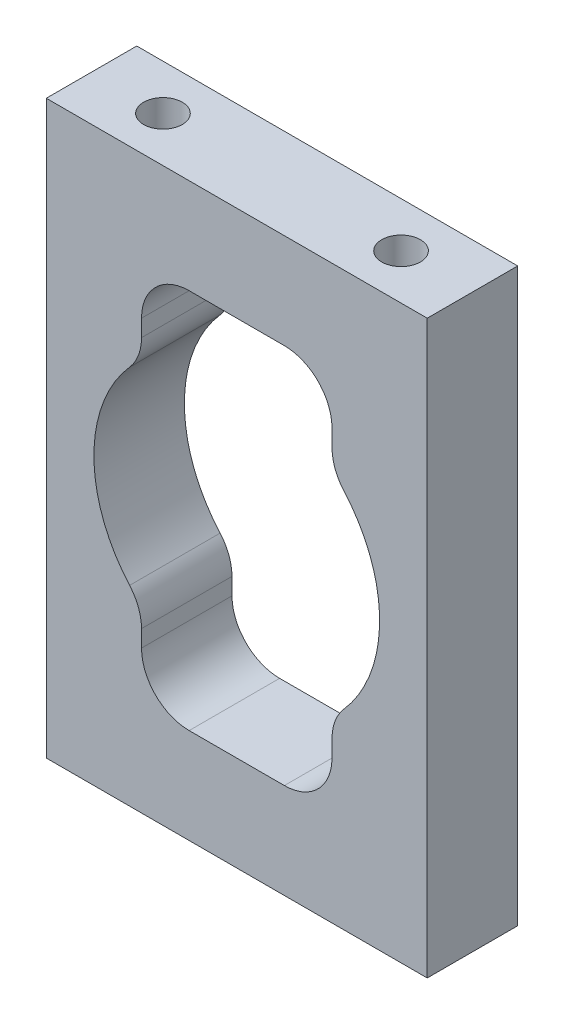
ISO-10303-21;
HEADER;
FILE_DESCRIPTION(('STEP AP214'),'2;1');
FILE_NAME('part.step','',(''),(''),'','','');
FILE_SCHEMA(('AUTOMOTIVE_DESIGN { 1 0 10303 214 1 1 1 1 }'));
ENDSEC;
DATA;
#1=APPLICATION_CONTEXT('core data for automotive mechanical design processes');
#2=APPLICATION_PROTOCOL_DEFINITION('international standard','automotive_design',2000,#1);
#3=PRODUCT_CONTEXT('',#1,'mechanical');
#4=PRODUCT('Part','Part','',(#3));
#5=PRODUCT_RELATED_PRODUCT_CATEGORY('part','',(#4));
#6=PRODUCT_DEFINITION_FORMATION('','',#4);
#7=PRODUCT_DEFINITION_CONTEXT('part definition',#1,'design');
#8=PRODUCT_DEFINITION('design','',#6,#7);
#9=PRODUCT_DEFINITION_SHAPE('','',#8);
#10=(LENGTH_UNIT() NAMED_UNIT(*) SI_UNIT(.MILLI.,.METRE.));
#11=(NAMED_UNIT(*) PLANE_ANGLE_UNIT() SI_UNIT($,.RADIAN.));
#12=(NAMED_UNIT(*) SI_UNIT($,.STERADIAN.) SOLID_ANGLE_UNIT());
#13=UNCERTAINTY_MEASURE_WITH_UNIT(LENGTH_MEASURE(1.E-05),#10,'distance_accuracy_value','');
#14=(GEOMETRIC_REPRESENTATION_CONTEXT(3) GLOBAL_UNCERTAINTY_ASSIGNED_CONTEXT((#13)) GLOBAL_UNIT_ASSIGNED_CONTEXT((#10,
#11,#12)) REPRESENTATION_CONTEXT('',''));
#15=CARTESIAN_POINT('',(0.,0.,0.));
#16=DIRECTION('',(0.,0.,1.));
#17=DIRECTION('',(1.,0.,0.));
#18=AXIS2_PLACEMENT_3D('',#15,#16,#17);
#19=CARTESIAN_POINT('',(-12.7,25.4,0.));
#20=DIRECTION('',(-1.,0.,0.));
#21=DIRECTION('',(0.,-1.,0.));
#22=AXIS2_PLACEMENT_3D('',#19,#20,#21);
#23=PLANE('',#22);
#24=DIRECTION('',(0.,-1.,0.));
#25=VECTOR('',#24,1.);
#26=CARTESIAN_POINT('',(-12.7,25.4,12.065));
#27=LINE('',#26,#25);
#28=CARTESIAN_POINT('',(-12.7,19.05,12.065));
#29=VERTEX_POINT('',#28);
#30=CARTESIAN_POINT('',(-12.7,16.8005208252602,12.065));
#31=VERTEX_POINT('',#30);
#32=EDGE_CURVE('E362',#29,#31,#27,.T.);
#33=ORIENTED_EDGE('',*,*,#32,.T.);
#34=DIRECTION('',(0.,0.,-1.));
#35=VECTOR('',#34,1.);
#36=CARTESIAN_POINT('',(-12.7,16.8005208252602,0.));
#37=LINE('',#36,#35);
#38=CARTESIAN_POINT('',(-12.7,16.8005208252602,0.));
#39=VERTEX_POINT('',#38);
#40=EDGE_CURVE('E295',#31,#39,#37,.T.);
#41=ORIENTED_EDGE('',*,*,#40,.T.);
#42=DIRECTION('',(0.,-1.,0.));
#43=VECTOR('',#42,1.);
#44=CARTESIAN_POINT('',(-12.7,25.4,0.));
#45=LINE('',#44,#43);
#46=CARTESIAN_POINT('',(-12.7,19.05,0.));
#47=VERTEX_POINT('',#46);
#48=EDGE_CURVE('E375',#47,#39,#45,.T.);
#49=ORIENTED_EDGE('',*,*,#48,.F.);
#50=DIRECTION('',(0.,0.,1.));
#51=VECTOR('',#50,1.);
#52=CARTESIAN_POINT('',(-12.7,19.05,12.065));
#53=LINE('',#52,#51);
#54=EDGE_CURVE('E260',#47,#29,#53,.T.);
#55=ORIENTED_EDGE('',*,*,#54,.T.);
#56=EDGE_LOOP('',(#33,#41,#49,#55));
#57=FACE_BOUND('',#56,.T.);
#58=ADVANCED_FACE('F38',(#57),#23,.F.);
#59=CARTESIAN_POINT('',(12.7,25.4,0.));
#60=DIRECTION('',(1.,0.,0.));
#61=DIRECTION('',(0.,1.,0.));
#62=AXIS2_PLACEMENT_3D('',#59,#60,#61);
#63=PLANE('',#62);
#64=DIRECTION('',(0.,1.,0.));
#65=VECTOR('',#64,1.);
#66=CARTESIAN_POINT('',(12.7,25.4,12.065));
#67=LINE('',#66,#65);
#68=CARTESIAN_POINT('',(12.7,-19.05,12.065));
#69=VERTEX_POINT('',#68);
#70=CARTESIAN_POINT('',(12.7,-16.8005208252602,12.065));
#71=VERTEX_POINT('',#70);
#72=EDGE_CURVE('E347',#69,#71,#67,.T.);
#73=ORIENTED_EDGE('',*,*,#72,.T.);
#74=DIRECTION('',(0.,0.,-1.));
#75=VECTOR('',#74,1.);
#76=CARTESIAN_POINT('',(12.7,-16.8005208252602,0.));
#77=LINE('',#76,#75);
#78=CARTESIAN_POINT('',(12.7,-16.8005208252602,0.));
#79=VERTEX_POINT('',#78);
#80=EDGE_CURVE('E318',#71,#79,#77,.T.);
#81=ORIENTED_EDGE('',*,*,#80,.T.);
#82=DIRECTION('',(0.,1.,0.));
#83=VECTOR('',#82,1.);
#84=CARTESIAN_POINT('',(12.7,25.4,0.));
#85=LINE('',#84,#83);
#86=CARTESIAN_POINT('',(12.7,-19.05,0.));
#87=VERTEX_POINT('',#86);
#88=EDGE_CURVE('E345',#87,#79,#85,.T.);
#89=ORIENTED_EDGE('',*,*,#88,.F.);
#90=DIRECTION('',(0.,0.,1.));
#91=VECTOR('',#90,1.);
#92=CARTESIAN_POINT('',(12.7,-19.05,12.065));
#93=LINE('',#92,#91);
#94=EDGE_CURVE('E269',#87,#69,#93,.T.);
#95=ORIENTED_EDGE('',*,*,#94,.T.);
#96=EDGE_LOOP('',(#73,#81,#89,#95));
#97=FACE_BOUND('',#96,.T.);
#98=ADVANCED_FACE('F344',(#97),#63,.F.);
#99=CARTESIAN_POINT('',(-25.4,-31.75,12.065));
#100=DIRECTION('',(1.,0.,0.));
#101=DIRECTION('',(0.,0.,-1.));
#102=AXIS2_PLACEMENT_3D('',#99,#100,#101);
#103=PLANE('',#102);
#104=DIRECTION('',(0.,-1.,0.));
#105=VECTOR('',#104,1.);
#106=CARTESIAN_POINT('',(-25.4,-31.75,0.));
#107=LINE('',#106,#105);
#108=CARTESIAN_POINT('',(-25.4,38.1,0.));
#109=VERTEX_POINT('',#108);
#110=CARTESIAN_POINT('',(-25.4,-38.1,0.));
#111=VERTEX_POINT('',#110);
#112=EDGE_CURVE('E247',#109,#111,#107,.T.);
#113=ORIENTED_EDGE('',*,*,#112,.T.);
#114=DIRECTION('',(0.,0.,-1.));
#115=VECTOR('',#114,1.);
#116=CARTESIAN_POINT('',(-25.4,-38.1,0.));
#117=LINE('',#116,#115);
#118=CARTESIAN_POINT('',(-25.4,-38.1,12.065));
#119=VERTEX_POINT('',#118);
#120=EDGE_CURVE('E235',#119,#111,#117,.T.);
#121=ORIENTED_EDGE('',*,*,#120,.F.);
#122=DIRECTION('',(0.,-1.,0.));
#123=VECTOR('',#122,1.);
#124=CARTESIAN_POINT('',(-25.4,-31.75,12.065));
#125=LINE('',#124,#123);
#126=CARTESIAN_POINT('',(-25.4,38.1,12.065));
#127=VERTEX_POINT('',#126);
#128=EDGE_CURVE('E248',#127,#119,#125,.T.);
#129=ORIENTED_EDGE('',*,*,#128,.F.);
#130=DIRECTION('',(0.,0.,-1.));
#131=VECTOR('',#130,1.);
#132=CARTESIAN_POINT('',(-25.4,38.1,0.));
#133=LINE('',#132,#131);
#134=EDGE_CURVE('E211',#127,#109,#133,.T.);
#135=ORIENTED_EDGE('',*,*,#134,.T.);
#136=EDGE_LOOP('',(#113,#121,#129,#135));
#137=FACE_BOUND('',#136,.T.);
#138=ADVANCED_FACE('F429',(#137),#103,.F.);
#139=CARTESIAN_POINT('',(25.4,-31.75,12.065));
#140=DIRECTION('',(-1.,0.,0.));
#141=DIRECTION('',(0.,0.,1.));
#142=AXIS2_PLACEMENT_3D('',#139,#140,#141);
#143=PLANE('',#142);
#144=DIRECTION('',(0.,1.,0.));
#145=VECTOR('',#144,1.);
#146=CARTESIAN_POINT('',(25.4,-31.75,0.));
#147=LINE('',#146,#145);
#148=CARTESIAN_POINT('',(25.4,-38.1,0.));
#149=VERTEX_POINT('',#148);
#150=CARTESIAN_POINT('',(25.4,38.1,0.));
#151=VERTEX_POINT('',#150);
#152=EDGE_CURVE('E251',#149,#151,#147,.T.);
#153=ORIENTED_EDGE('',*,*,#152,.T.);
#154=DIRECTION('',(0.,0.,1.));
#155=VECTOR('',#154,1.);
#156=CARTESIAN_POINT('',(25.4,38.1,0.));
#157=LINE('',#156,#155);
#158=CARTESIAN_POINT('',(25.4,38.1,12.065));
#159=VERTEX_POINT('',#158);
#160=EDGE_CURVE('E217',#151,#159,#157,.T.);
#161=ORIENTED_EDGE('',*,*,#160,.T.);
#162=DIRECTION('',(0.,1.,0.));
#163=VECTOR('',#162,1.);
#164=CARTESIAN_POINT('',(25.4,-31.75,12.065));
#165=LINE('',#164,#163);
#166=CARTESIAN_POINT('',(25.4,-38.1,12.065));
#167=VERTEX_POINT('',#166);
#168=EDGE_CURVE('E250',#167,#159,#165,.T.);
#169=ORIENTED_EDGE('',*,*,#168,.F.);
#170=DIRECTION('',(0.,0.,1.));
#171=VECTOR('',#170,1.);
#172=CARTESIAN_POINT('',(25.4,-38.1,0.));
#173=LINE('',#172,#171);
#174=EDGE_CURVE('E241',#149,#167,#173,.T.);
#175=ORIENTED_EDGE('',*,*,#174,.F.);
#176=EDGE_LOOP('',(#153,#161,#169,#175));
#177=FACE_BOUND('',#176,.T.);
#178=ADVANCED_FACE('F467',(#177),#143,.F.);
#179=CARTESIAN_POINT('',(0.,0.,12.065));
#180=DIRECTION('',(0.,0.,1.));
#181=DIRECTION('',(1.,0.,0.));
#182=AXIS2_PLACEMENT_3D('',#179,#180,#181);
#183=PLANE('',#182);
#184=CARTESIAN_POINT('',(0.,0.,12.065));
#185=DIRECTION('',(0.,0.,-1.));
#186=DIRECTION('',(-1.,0.,0.));
#187=AXIS2_PLACEMENT_3D('',#184,#185,#186);
#188=CIRCLE('',#187,19.05);
#189=CARTESIAN_POINT('',(-14.2875,-12.6003906189452,12.065));
#190=VERTEX_POINT('',#189);
#191=CARTESIAN_POINT('',(-14.2875,12.6003906189451,12.065));
#192=VERTEX_POINT('',#191);
#193=EDGE_CURVE('E337',#190,#192,#188,.T.);
#194=ORIENTED_EDGE('',*,*,#193,.T.);
#195=CARTESIAN_POINT('',(-19.05,16.8005208252602,12.065));
#196=DIRECTION('',(0.,0.,1.));
#197=DIRECTION('',(1.,0.,0.));
#198=AXIS2_PLACEMENT_3D('',#195,#196,#197);
#199=CIRCLE('',#198,6.35);
#200=EDGE_CURVE('E314',#192,#31,#199,.T.);
#201=ORIENTED_EDGE('',*,*,#200,.T.);
#202=ORIENTED_EDGE('',*,*,#32,.F.);
#203=CARTESIAN_POINT('',(-6.35,19.05,12.065));
#204=DIRECTION('',(0.,0.,1.));
#205=DIRECTION('',(1.,0.,0.));
#206=AXIS2_PLACEMENT_3D('',#203,#204,#205);
#207=CIRCLE('',#206,6.35);
#208=CARTESIAN_POINT('',(-6.35,25.4,12.065));
#209=VERTEX_POINT('',#208);
#210=EDGE_CURVE('E291',#29,#209,#207,.F.);
#211=ORIENTED_EDGE('',*,*,#210,.T.);
#212=DIRECTION('',(-1.,0.,0.));
#213=VECTOR('',#212,1.);
#214=CARTESIAN_POINT('',(-12.7,25.4,12.065));
#215=LINE('',#214,#213);
#216=CARTESIAN_POINT('',(6.35,25.4,12.065));
#217=VERTEX_POINT('',#216);
#218=EDGE_CURVE('E369',#217,#209,#215,.T.);
#219=ORIENTED_EDGE('',*,*,#218,.F.);
#220=CARTESIAN_POINT('',(6.35,19.05,12.065));
#221=DIRECTION('',(0.,0.,1.));
#222=DIRECTION('',(1.,0.,0.));
#223=AXIS2_PLACEMENT_3D('',#220,#221,#222);
#224=CIRCLE('',#223,6.35);
#225=CARTESIAN_POINT('',(12.7,19.05,12.065));
#226=VERTEX_POINT('',#225);
#227=EDGE_CURVE('E286',#217,#226,#224,.F.);
#228=ORIENTED_EDGE('',*,*,#227,.T.);
#229=CARTESIAN_POINT('',(12.7,16.8005208252601,12.065));
#230=VERTEX_POINT('',#229);
#231=EDGE_CURVE('E368',#230,#226,#67,.T.);
#232=ORIENTED_EDGE('',*,*,#231,.F.);
#233=CARTESIAN_POINT('',(19.05,16.8005208252601,12.065));
#234=DIRECTION('',(0.,0.,1.));
#235=DIRECTION('',(1.,0.,0.));
#236=AXIS2_PLACEMENT_3D('',#233,#234,#235);
#237=CIRCLE('',#236,6.35);
#238=CARTESIAN_POINT('',(14.2875,12.6003906189451,12.065));
#239=VERTEX_POINT('',#238);
#240=EDGE_CURVE('E310',#230,#239,#237,.T.);
#241=ORIENTED_EDGE('',*,*,#240,.T.);
#242=CARTESIAN_POINT('',(14.2875,-12.6003906189451,12.065));
#243=VERTEX_POINT('',#242);
#244=EDGE_CURVE('E327',#239,#243,#188,.T.);
#245=ORIENTED_EDGE('',*,*,#244,.T.);
#246=CARTESIAN_POINT('',(19.05,-16.8005208252602,12.065));
#247=DIRECTION('',(0.,0.,1.));
#248=DIRECTION('',(1.,0.,0.));
#249=AXIS2_PLACEMENT_3D('',#246,#247,#248);
#250=CIRCLE('',#249,6.35);
#251=EDGE_CURVE('E61',#243,#71,#250,.T.);
#252=ORIENTED_EDGE('',*,*,#251,.T.);
#253=ORIENTED_EDGE('',*,*,#72,.F.);
#254=CARTESIAN_POINT('',(6.35000000000001,-19.05,12.065));
#255=DIRECTION('',(0.,0.,1.));
#256=DIRECTION('',(1.,0.,0.));
#257=AXIS2_PLACEMENT_3D('',#254,#255,#256);
#258=CIRCLE('',#257,6.35);
#259=CARTESIAN_POINT('',(6.35000000000001,-25.4,12.065));
#260=VERTEX_POINT('',#259);
#261=EDGE_CURVE('E282',#69,#260,#258,.F.);
#262=ORIENTED_EDGE('',*,*,#261,.T.);
#263=DIRECTION('',(1.,0.,0.));
#264=VECTOR('',#263,1.);
#265=CARTESIAN_POINT('',(-12.7,-25.4,12.065));
#266=LINE('',#265,#264);
#267=CARTESIAN_POINT('',(-6.34999999999999,-25.4,12.065));
#268=VERTEX_POINT('',#267);
#269=EDGE_CURVE('E365',#268,#260,#266,.T.);
#270=ORIENTED_EDGE('',*,*,#269,.F.);
#271=CARTESIAN_POINT('',(-6.34999999999999,-19.05,12.065));
#272=DIRECTION('',(0.,0.,1.));
#273=DIRECTION('',(1.,0.,0.));
#274=AXIS2_PLACEMENT_3D('',#271,#272,#273);
#275=CIRCLE('',#274,6.35);
#276=CARTESIAN_POINT('',(-12.7,-19.05,12.065));
#277=VERTEX_POINT('',#276);
#278=EDGE_CURVE('E277',#268,#277,#275,.F.);
#279=ORIENTED_EDGE('',*,*,#278,.T.);
#280=CARTESIAN_POINT('',(-12.7,-16.8005208252602,12.065));
#281=VERTEX_POINT('',#280);
#282=EDGE_CURVE('E336',#281,#277,#27,.T.);
#283=ORIENTED_EDGE('',*,*,#282,.F.);
#284=CARTESIAN_POINT('',(-19.05,-16.8005208252602,12.065));
#285=DIRECTION('',(0.,0.,1.));
#286=DIRECTION('',(1.,0.,0.));
#287=AXIS2_PLACEMENT_3D('',#284,#285,#286);
#288=CIRCLE('',#287,6.35);
#289=EDGE_CURVE('E53',#281,#190,#288,.T.);
#290=ORIENTED_EDGE('',*,*,#289,.T.);
#291=EDGE_LOOP('',(#194,#201,#202,#211,#219,#228,#232,#241,#245,#252,#253,#262,#270,#279,#283,#290));
#292=FACE_BOUND('',#291,.T.);
#293=ORIENTED_EDGE('',*,*,#128,.T.);
#294=DIRECTION('',(-1.,0.,0.));
#295=VECTOR('',#294,1.);
#296=CARTESIAN_POINT('',(-25.4,-38.1,12.065));
#297=LINE('',#296,#295);
#298=EDGE_CURVE('E244',#167,#119,#297,.T.);
#299=ORIENTED_EDGE('',*,*,#298,.F.);
#300=ORIENTED_EDGE('',*,*,#168,.T.);
#301=DIRECTION('',(-1.,0.,0.));
#302=VECTOR('',#301,1.);
#303=CARTESIAN_POINT('',(-25.4,38.1,12.065));
#304=LINE('',#303,#302);
#305=EDGE_CURVE('E214',#159,#127,#304,.T.);
#306=ORIENTED_EDGE('',*,*,#305,.T.);
#307=EDGE_LOOP('',(#293,#299,#300,#306));
#308=FACE_BOUND('',#307,.T.);
#309=ADVANCED_FACE('F333',(#292,#308),#183,.T.);
#310=CARTESIAN_POINT('',(0.,0.,0.));
#311=DIRECTION('',(0.,0.,1.));
#312=DIRECTION('',(1.,0.,0.));
#313=AXIS2_PLACEMENT_3D('',#310,#311,#312);
#314=PLANE('',#313);
#315=ORIENTED_EDGE('',*,*,#48,.T.);
#316=CARTESIAN_POINT('',(-19.05,16.8005208252602,0.));
#317=DIRECTION('',(0.,0.,1.));
#318=DIRECTION('',(1.,0.,0.));
#319=AXIS2_PLACEMENT_3D('',#316,#317,#318);
#320=CIRCLE('',#319,6.35);
#321=CARTESIAN_POINT('',(-14.2875,12.6003906189451,0.));
#322=VERTEX_POINT('',#321);
#323=EDGE_CURVE('E304',#39,#322,#320,.F.);
#324=ORIENTED_EDGE('',*,*,#323,.T.);
#325=CARTESIAN_POINT('',(0.,0.,0.));
#326=DIRECTION('',(0.,0.,-1.));
#327=DIRECTION('',(-1.,0.,0.));
#328=AXIS2_PLACEMENT_3D('',#325,#326,#327);
#329=CIRCLE('',#328,19.05);
#330=CARTESIAN_POINT('',(-14.2875,-12.6003906189452,0.));
#331=VERTEX_POINT('',#330);
#332=EDGE_CURVE('E378',#331,#322,#329,.T.);
#333=ORIENTED_EDGE('',*,*,#332,.F.);
#334=CARTESIAN_POINT('',(-19.05,-16.8005208252602,0.));
#335=DIRECTION('',(0.,0.,1.));
#336=DIRECTION('',(1.,0.,0.));
#337=AXIS2_PLACEMENT_3D('',#334,#335,#336);
#338=CIRCLE('',#337,6.35);
#339=CARTESIAN_POINT('',(-12.7,-16.8005208252602,0.));
#340=VERTEX_POINT('',#339);
#341=EDGE_CURVE('E302',#331,#340,#338,.F.);
#342=ORIENTED_EDGE('',*,*,#341,.T.);
#343=CARTESIAN_POINT('',(-12.7,-19.05,0.));
#344=VERTEX_POINT('',#343);
#345=EDGE_CURVE('E371',#340,#344,#45,.T.);
#346=ORIENTED_EDGE('',*,*,#345,.T.);
#347=CARTESIAN_POINT('',(-6.34999999999999,-19.05,0.));
#348=DIRECTION('',(0.,0.,1.));
#349=DIRECTION('',(1.,0.,0.));
#350=AXIS2_PLACEMENT_3D('',#347,#348,#349);
#351=CIRCLE('',#350,6.35);
#352=CARTESIAN_POINT('',(-6.34999999999999,-25.4,0.));
#353=VERTEX_POINT('',#352);
#354=EDGE_CURVE('E280',#344,#353,#351,.T.);
#355=ORIENTED_EDGE('',*,*,#354,.T.);
#356=DIRECTION('',(1.,0.,0.));
#357=VECTOR('',#356,1.);
#358=CARTESIAN_POINT('',(-12.7,-25.4,0.));
#359=LINE('',#358,#357);
#360=CARTESIAN_POINT('',(6.35000000000001,-25.4,0.));
#361=VERTEX_POINT('',#360);
#362=EDGE_CURVE('E358',#353,#361,#359,.T.);
#363=ORIENTED_EDGE('',*,*,#362,.T.);
#364=CARTESIAN_POINT('',(6.35000000000001,-19.05,0.));
#365=DIRECTION('',(0.,0.,1.));
#366=DIRECTION('',(1.,0.,0.));
#367=AXIS2_PLACEMENT_3D('',#364,#365,#366);
#368=CIRCLE('',#367,6.35);
#369=EDGE_CURVE('E284',#361,#87,#368,.T.);
#370=ORIENTED_EDGE('',*,*,#369,.T.);
#371=ORIENTED_EDGE('',*,*,#88,.T.);
#372=CARTESIAN_POINT('',(19.05,-16.8005208252602,0.));
#373=DIRECTION('',(0.,0.,1.));
#374=DIRECTION('',(1.,0.,0.));
#375=AXIS2_PLACEMENT_3D('',#372,#373,#374);
#376=CIRCLE('',#375,6.35);
#377=CARTESIAN_POINT('',(14.2875,-12.6003906189451,0.));
#378=VERTEX_POINT('',#377);
#379=EDGE_CURVE('E300',#79,#378,#376,.F.);
#380=ORIENTED_EDGE('',*,*,#379,.T.);
#381=CARTESIAN_POINT('',(14.2875,12.6003906189451,0.));
#382=VERTEX_POINT('',#381);
#383=EDGE_CURVE('E330',#382,#378,#329,.T.);
#384=ORIENTED_EDGE('',*,*,#383,.F.);
#385=CARTESIAN_POINT('',(19.05,16.8005208252601,0.));
#386=DIRECTION('',(0.,0.,1.));
#387=DIRECTION('',(1.,0.,0.));
#388=AXIS2_PLACEMENT_3D('',#385,#386,#387);
#389=CIRCLE('',#388,6.35);
#390=CARTESIAN_POINT('',(12.7,16.8005208252601,0.));
#391=VERTEX_POINT('',#390);
#392=EDGE_CURVE('E298',#382,#391,#389,.F.);
#393=ORIENTED_EDGE('',*,*,#392,.T.);
#394=CARTESIAN_POINT('',(12.7,19.05,0.));
#395=VERTEX_POINT('',#394);
#396=EDGE_CURVE('E354',#391,#395,#85,.T.);
#397=ORIENTED_EDGE('',*,*,#396,.T.);
#398=CARTESIAN_POINT('',(6.35,19.05,0.));
#399=DIRECTION('',(0.,0.,1.));
#400=DIRECTION('',(1.,0.,0.));
#401=AXIS2_PLACEMENT_3D('',#398,#399,#400);
#402=CIRCLE('',#401,6.35);
#403=CARTESIAN_POINT('',(6.35,25.4,0.));
#404=VERTEX_POINT('',#403);
#405=EDGE_CURVE('E289',#395,#404,#402,.T.);
#406=ORIENTED_EDGE('',*,*,#405,.T.);
#407=DIRECTION('',(-1.,0.,0.));
#408=VECTOR('',#407,1.);
#409=CARTESIAN_POINT('',(-12.7,25.4,0.));
#410=LINE('',#409,#408);
#411=CARTESIAN_POINT('',(-6.35,25.4,0.));
#412=VERTEX_POINT('',#411);
#413=EDGE_CURVE('E205',#404,#412,#410,.T.);
#414=ORIENTED_EDGE('',*,*,#413,.T.);
#415=CARTESIAN_POINT('',(-6.35,19.05,0.));
#416=DIRECTION('',(0.,0.,1.));
#417=DIRECTION('',(1.,0.,0.));
#418=AXIS2_PLACEMENT_3D('',#415,#416,#417);
#419=CIRCLE('',#418,6.35);
#420=EDGE_CURVE('E293',#412,#47,#419,.T.);
#421=ORIENTED_EDGE('',*,*,#420,.T.);
#422=EDGE_LOOP('',(#315,#324,#333,#342,#346,#355,#363,#370,#371,#380,#384,#393,#397,#406,#414,#421));
#423=FACE_BOUND('',#422,.T.);
#424=ORIENTED_EDGE('',*,*,#112,.F.);
#425=DIRECTION('',(1.,0.,0.));
#426=VECTOR('',#425,1.);
#427=CARTESIAN_POINT('',(-25.4,38.1,0.));
#428=LINE('',#427,#426);
#429=EDGE_CURVE('E220',#109,#151,#428,.T.);
#430=ORIENTED_EDGE('',*,*,#429,.T.);
#431=ORIENTED_EDGE('',*,*,#152,.F.);
#432=DIRECTION('',(1.,0.,0.));
#433=VECTOR('',#432,1.);
#434=CARTESIAN_POINT('',(-25.4,-38.1,0.));
#435=LINE('',#434,#433);
#436=EDGE_CURVE('E238',#111,#149,#435,.T.);
#437=ORIENTED_EDGE('',*,*,#436,.F.);
#438=EDGE_LOOP('',(#424,#430,#431,#437));
#439=FACE_BOUND('',#438,.T.);
#440=ADVANCED_FACE('F350',(#423,#439),#314,.F.);
#441=CARTESIAN_POINT('',(0.,-38.1,0.));
#442=DIRECTION('',(0.,1.,0.));
#443=DIRECTION('',(-1.,0.,0.));
#444=AXIS2_PLACEMENT_3D('',#441,#442,#443);
#445=PLANE('',#444);
#446=CARTESIAN_POINT('',(-15.875,-38.1,6.0325));
#447=DIRECTION('',(0.,-1.,0.));
#448=DIRECTION('',(0.,0.,-1.));
#449=AXIS2_PLACEMENT_3D('',#446,#447,#448);
#450=CIRCLE('',#449,2.57975099999999);
#451=CARTESIAN_POINT('',(-15.875,-38.1,3.45274900000001));
#452=VERTEX_POINT('',#451);
#453=EDGE_CURVE('E223',#452,#452,#450,.T.);
#454=ORIENTED_EDGE('',*,*,#453,.F.);
#455=EDGE_LOOP('',(#454));
#456=FACE_BOUND('',#455,.T.);
#457=CARTESIAN_POINT('',(15.875,-38.1,6.0325));
#458=DIRECTION('',(0.,-1.,0.));
#459=DIRECTION('',(0.,0.,-1.));
#460=AXIS2_PLACEMENT_3D('',#457,#458,#459);
#461=CIRCLE('',#460,2.57975099999999);
#462=CARTESIAN_POINT('',(15.875,-38.1,3.45274900000001));
#463=VERTEX_POINT('',#462);
#464=EDGE_CURVE('E229',#463,#463,#461,.T.);
#465=ORIENTED_EDGE('',*,*,#464,.F.);
#466=EDGE_LOOP('',(#465));
#467=FACE_BOUND('',#466,.T.);
#468=ORIENTED_EDGE('',*,*,#120,.T.);
#469=ORIENTED_EDGE('',*,*,#436,.T.);
#470=ORIENTED_EDGE('',*,*,#174,.T.);
#471=ORIENTED_EDGE('',*,*,#298,.T.);
#472=EDGE_LOOP('',(#468,#469,#470,#471));
#473=FACE_BOUND('',#472,.T.);
#474=ADVANCED_FACE('F460',(#456,#467,#473),#445,.F.);
#475=CARTESIAN_POINT('',(15.875,-22.86,6.0325));
#476=DIRECTION('',(0.,-1.,0.));
#477=DIRECTION('',(0.,0.,-1.));
#478=AXIS2_PLACEMENT_3D('',#475,#476,#477);
#479=CONICAL_SURFACE('',#478,2.57975099999999,1.02974425867665);
#480=CARTESIAN_POINT('',(15.875,-21.309929217203,6.0325));
#481=VERTEX_POINT('',#480);
#482=VERTEX_LOOP('',#481);
#483=FACE_BOUND('',#482,.T.);
#484=CARTESIAN_POINT('',(15.875,-22.86,6.0325));
#485=DIRECTION('',(0.,-1.,0.));
#486=DIRECTION('',(0.,0.,-1.));
#487=AXIS2_PLACEMENT_3D('',#484,#485,#486);
#488=CIRCLE('',#487,2.57975099999999);
#489=CARTESIAN_POINT('',(15.875,-22.86,3.45274900000001));
#490=VERTEX_POINT('',#489);
#491=EDGE_CURVE('E232',#490,#490,#488,.T.);
#492=ORIENTED_EDGE('',*,*,#491,.T.);
#493=EDGE_LOOP('',(#492));
#494=FACE_BOUND('',#493,.T.);
#495=ADVANCED_FACE('F456',(#483,#494),#479,.F.);
#496=CARTESIAN_POINT('',(15.875,-38.1,6.0325));
#497=DIRECTION('',(0.,-1.,0.));
#498=DIRECTION('',(0.,0.,-1.));
#499=AXIS2_PLACEMENT_3D('',#496,#497,#498);
#500=CYLINDRICAL_SURFACE('',#499,2.57975099999999);
#501=ORIENTED_EDGE('',*,*,#491,.F.);
#502=EDGE_LOOP('',(#501));
#503=FACE_BOUND('',#502,.T.);
#504=ORIENTED_EDGE('',*,*,#464,.T.);
#505=EDGE_LOOP('',(#504));
#506=FACE_BOUND('',#505,.T.);
#507=ADVANCED_FACE('F452',(#503,#506),#500,.F.);
#508=CARTESIAN_POINT('',(-15.875,-22.86,6.0325));
#509=DIRECTION('',(0.,-1.,0.));
#510=DIRECTION('',(0.,0.,-1.));
#511=AXIS2_PLACEMENT_3D('',#508,#509,#510);
#512=CONICAL_SURFACE('',#511,2.579751,1.02974425867665);
#513=CARTESIAN_POINT('',(-15.875,-21.3099292172031,6.0325));
#514=VERTEX_POINT('',#513);
#515=VERTEX_LOOP('',#514);
#516=FACE_BOUND('',#515,.T.);
#517=CARTESIAN_POINT('',(-15.875,-22.86,6.0325));
#518=DIRECTION('',(0.,-1.,0.));
#519=DIRECTION('',(0.,0.,-1.));
#520=AXIS2_PLACEMENT_3D('',#517,#518,#519);
#521=CIRCLE('',#520,2.579751);
#522=CARTESIAN_POINT('',(-15.875,-22.86,3.452749));
#523=VERTEX_POINT('',#522);
#524=EDGE_CURVE('E226',#523,#523,#521,.T.);
#525=ORIENTED_EDGE('',*,*,#524,.T.);
#526=EDGE_LOOP('',(#525));
#527=FACE_BOUND('',#526,.T.);
#528=ADVANCED_FACE('F448',(#516,#527),#512,.F.);
#529=CARTESIAN_POINT('',(-15.875,-38.1,6.0325));
#530=DIRECTION('',(0.,-1.,0.));
#531=DIRECTION('',(0.,0.,-1.));
#532=AXIS2_PLACEMENT_3D('',#529,#530,#531);
#533=CYLINDRICAL_SURFACE('',#532,2.57975099999999);
#534=ORIENTED_EDGE('',*,*,#524,.F.);
#535=EDGE_LOOP('',(#534));
#536=FACE_BOUND('',#535,.T.);
#537=ORIENTED_EDGE('',*,*,#453,.T.);
#538=EDGE_LOOP('',(#537));
#539=FACE_BOUND('',#538,.T.);
#540=ADVANCED_FACE('F444',(#536,#539),#533,.F.);
#541=CARTESIAN_POINT('',(0.,38.1,0.));
#542=DIRECTION('',(0.,-1.,0.));
#543=DIRECTION('',(-1.,0.,0.));
#544=AXIS2_PLACEMENT_3D('',#541,#542,#543);
#545=PLANE('',#544);
#546=CARTESIAN_POINT('',(-15.875,38.1,6.0325));
#547=DIRECTION('',(0.,1.,0.));
#548=DIRECTION('',(0.,0.,1.));
#549=AXIS2_PLACEMENT_3D('',#546,#547,#548);
#550=CIRCLE('',#549,2.57975099999999);
#551=CARTESIAN_POINT('',(-15.875,38.1,8.61225099999999));
#552=VERTEX_POINT('',#551);
#553=EDGE_CURVE('E199',#552,#552,#550,.T.);
#554=ORIENTED_EDGE('',*,*,#553,.F.);
#555=EDGE_LOOP('',(#554));
#556=FACE_BOUND('',#555,.T.);
#557=CARTESIAN_POINT('',(15.875,38.1,6.0325));
#558=DIRECTION('',(0.,1.,0.));
#559=DIRECTION('',(0.,0.,1.));
#560=AXIS2_PLACEMENT_3D('',#557,#558,#559);
#561=CIRCLE('',#560,2.57975099999999);
#562=CARTESIAN_POINT('',(15.875,38.1,8.61225099999999));
#563=VERTEX_POINT('',#562);
#564=EDGE_CURVE('E198',#563,#563,#561,.T.);
#565=ORIENTED_EDGE('',*,*,#564,.F.);
#566=EDGE_LOOP('',(#565));
#567=FACE_BOUND('',#566,.T.);
#568=ORIENTED_EDGE('',*,*,#134,.F.);
#569=ORIENTED_EDGE('',*,*,#305,.F.);
#570=ORIENTED_EDGE('',*,*,#160,.F.);
#571=ORIENTED_EDGE('',*,*,#429,.F.);
#572=EDGE_LOOP('',(#568,#569,#570,#571));
#573=FACE_BOUND('',#572,.T.);
#574=ADVANCED_FACE('F440',(#556,#567,#573),#545,.F.);
#575=CARTESIAN_POINT('',(15.875,22.86,6.0325));
#576=DIRECTION('',(0.,1.,0.));
#577=DIRECTION('',(0.,0.,1.));
#578=AXIS2_PLACEMENT_3D('',#575,#576,#577);
#579=CONICAL_SURFACE('',#578,2.57975099999999,1.02974425867665);
#580=CARTESIAN_POINT('',(15.875,21.309929217203,6.0325));
#581=VERTEX_POINT('',#580);
#582=VERTEX_LOOP('',#581);
#583=FACE_BOUND('',#582,.T.);
#584=CARTESIAN_POINT('',(15.875,22.86,6.0325));
#585=DIRECTION('',(0.,1.,0.));
#586=DIRECTION('',(0.,0.,1.));
#587=AXIS2_PLACEMENT_3D('',#584,#585,#586);
#588=CIRCLE('',#587,2.57975099999999);
#589=CARTESIAN_POINT('',(15.875,22.86,8.612251));
#590=VERTEX_POINT('',#589);
#591=EDGE_CURVE('E202',#590,#590,#588,.T.);
#592=ORIENTED_EDGE('',*,*,#591,.T.);
#593=EDGE_LOOP('',(#592));
#594=FACE_BOUND('',#593,.T.);
#595=ADVANCED_FACE('F436',(#583,#594),#579,.F.);
#596=CARTESIAN_POINT('',(15.875,38.1,6.0325));
#597=DIRECTION('',(0.,1.,0.));
#598=DIRECTION('',(0.,0.,1.));
#599=AXIS2_PLACEMENT_3D('',#596,#597,#598);
#600=CYLINDRICAL_SURFACE('',#599,2.57975099999999);
#601=ORIENTED_EDGE('',*,*,#591,.F.);
#602=EDGE_LOOP('',(#601));
#603=FACE_BOUND('',#602,.T.);
#604=ORIENTED_EDGE('',*,*,#564,.T.);
#605=EDGE_LOOP('',(#604));
#606=FACE_BOUND('',#605,.T.);
#607=ADVANCED_FACE('F192',(#603,#606),#600,.F.);
#608=CARTESIAN_POINT('',(-15.875,22.86,6.0325));
#609=DIRECTION('',(0.,1.,0.));
#610=DIRECTION('',(0.,0.,1.));
#611=AXIS2_PLACEMENT_3D('',#608,#609,#610);
#612=CONICAL_SURFACE('',#611,2.579751,1.02974425867665);
#613=CARTESIAN_POINT('',(-15.875,21.3099292172031,6.0325));
#614=VERTEX_POINT('',#613);
#615=VERTEX_LOOP('',#614);
#616=FACE_BOUND('',#615,.T.);
#617=CARTESIAN_POINT('',(-15.875,22.86,6.0325));
#618=DIRECTION('',(0.,1.,0.));
#619=DIRECTION('',(0.,0.,1.));
#620=AXIS2_PLACEMENT_3D('',#617,#618,#619);
#621=CIRCLE('',#620,2.579751);
#622=CARTESIAN_POINT('',(-15.875,22.86,8.612251));
#623=VERTEX_POINT('',#622);
#624=EDGE_CURVE('E196',#623,#623,#621,.T.);
#625=ORIENTED_EDGE('',*,*,#624,.T.);
#626=EDGE_LOOP('',(#625));
#627=FACE_BOUND('',#626,.T.);
#628=ADVANCED_FACE('F188',(#616,#627),#612,.F.);
#629=CARTESIAN_POINT('',(-15.875,38.1,6.0325));
#630=DIRECTION('',(0.,1.,0.));
#631=DIRECTION('',(0.,0.,1.));
#632=AXIS2_PLACEMENT_3D('',#629,#630,#631);
#633=CYLINDRICAL_SURFACE('',#632,2.57975099999999);
#634=ORIENTED_EDGE('',*,*,#624,.F.);
#635=EDGE_LOOP('',(#634));
#636=FACE_BOUND('',#635,.T.);
#637=ORIENTED_EDGE('',*,*,#553,.T.);
#638=EDGE_LOOP('',(#637));
#639=FACE_BOUND('',#638,.T.);
#640=ADVANCED_FACE('F191',(#636,#639),#633,.F.);
#641=ORIENTED_EDGE('',*,*,#345,.F.);
#642=DIRECTION('',(0.,0.,-1.));
#643=VECTOR('',#642,1.);
#644=CARTESIAN_POINT('',(-12.7,-16.8005208252602,0.));
#645=LINE('',#644,#643);
#646=EDGE_CURVE('E316',#340,#281,#645,.F.);
#647=ORIENTED_EDGE('',*,*,#646,.T.);
#648=ORIENTED_EDGE('',*,*,#282,.T.);
#649=DIRECTION('',(0.,0.,1.));
#650=VECTOR('',#649,1.);
#651=CARTESIAN_POINT('',(-12.7,-19.05,0.));
#652=LINE('',#651,#650);
#653=EDGE_CURVE('E263',#277,#344,#652,.F.);
#654=ORIENTED_EDGE('',*,*,#653,.T.);
#655=EDGE_LOOP('',(#641,#647,#648,#654));
#656=FACE_BOUND('',#655,.T.);
#657=ADVANCED_FACE('F411',(#656),#23,.F.);
#658=CARTESIAN_POINT('',(-12.7,25.4,0.));
#659=DIRECTION('',(0.,1.,0.));
#660=DIRECTION('',(0.,0.,1.));
#661=AXIS2_PLACEMENT_3D('',#658,#659,#660);
#662=PLANE('',#661);
#663=ORIENTED_EDGE('',*,*,#413,.F.);
#664=DIRECTION('',(0.,0.,1.));
#665=VECTOR('',#664,1.);
#666=CARTESIAN_POINT('',(6.35,25.4,12.065));
#667=LINE('',#666,#665);
#668=EDGE_CURVE('E274',#404,#217,#667,.T.);
#669=ORIENTED_EDGE('',*,*,#668,.T.);
#670=ORIENTED_EDGE('',*,*,#218,.T.);
#671=DIRECTION('',(0.,0.,1.));
#672=VECTOR('',#671,1.);
#673=CARTESIAN_POINT('',(-6.35,25.4,0.));
#674=LINE('',#673,#672);
#675=EDGE_CURVE('E272',#209,#412,#674,.F.);
#676=ORIENTED_EDGE('',*,*,#675,.T.);
#677=EDGE_LOOP('',(#663,#669,#670,#676));
#678=FACE_BOUND('',#677,.T.);
#679=ADVANCED_FACE('F409',(#678),#662,.F.);
#680=ORIENTED_EDGE('',*,*,#396,.F.);
#681=DIRECTION('',(0.,0.,-1.));
#682=VECTOR('',#681,1.);
#683=CARTESIAN_POINT('',(12.7,16.8005208252601,0.));
#684=LINE('',#683,#682);
#685=EDGE_CURVE('E11',#391,#230,#684,.F.);
#686=ORIENTED_EDGE('',*,*,#685,.T.);
#687=ORIENTED_EDGE('',*,*,#231,.T.);
#688=DIRECTION('',(0.,0.,1.));
#689=VECTOR('',#688,1.);
#690=CARTESIAN_POINT('',(12.7,19.05,0.));
#691=LINE('',#690,#689);
#692=EDGE_CURVE('E266',#226,#395,#691,.F.);
#693=ORIENTED_EDGE('',*,*,#692,.T.);
#694=EDGE_LOOP('',(#680,#686,#687,#693));
#695=FACE_BOUND('',#694,.T.);
#696=ADVANCED_FACE('F404',(#695),#63,.F.);
#697=CARTESIAN_POINT('',(-12.7,-25.4,0.));
#698=DIRECTION('',(0.,-1.,0.));
#699=DIRECTION('',(0.,0.,-1.));
#700=AXIS2_PLACEMENT_3D('',#697,#698,#699);
#701=PLANE('',#700);
#702=ORIENTED_EDGE('',*,*,#362,.F.);
#703=DIRECTION('',(0.,0.,1.));
#704=VECTOR('',#703,1.);
#705=CARTESIAN_POINT('',(-6.34999999999999,-25.4,12.065));
#706=LINE('',#705,#704);
#707=EDGE_CURVE('E257',#353,#268,#706,.T.);
#708=ORIENTED_EDGE('',*,*,#707,.T.);
#709=ORIENTED_EDGE('',*,*,#269,.T.);
#710=DIRECTION('',(0.,0.,1.));
#711=VECTOR('',#710,1.);
#712=CARTESIAN_POINT('',(6.35000000000001,-25.4,0.));
#713=LINE('',#712,#711);
#714=EDGE_CURVE('E253',#260,#361,#713,.F.);
#715=ORIENTED_EDGE('',*,*,#714,.T.);
#716=EDGE_LOOP('',(#702,#708,#709,#715));
#717=FACE_BOUND('',#716,.T.);
#718=ADVANCED_FACE('F418',(#717),#701,.F.);
#719=CARTESIAN_POINT('',(-6.34999999999999,-19.05,0.));
#720=DIRECTION('',(0.,0.,-1.));
#721=DIRECTION('',(-1.,0.,0.));
#722=AXIS2_PLACEMENT_3D('',#719,#720,#721);
#723=CYLINDRICAL_SURFACE('',#722,6.35);
#724=ORIENTED_EDGE('',*,*,#354,.F.);
#725=ORIENTED_EDGE('',*,*,#653,.F.);
#726=ORIENTED_EDGE('',*,*,#278,.F.);
#727=ORIENTED_EDGE('',*,*,#707,.F.);
#728=EDGE_LOOP('',(#724,#725,#726,#727));
#729=FACE_BOUND('',#728,.T.);
#730=ADVANCED_FACE('F476',(#729),#723,.F.);
#731=CARTESIAN_POINT('',(6.35000000000001,-19.05,0.));
#732=DIRECTION('',(0.,0.,-1.));
#733=DIRECTION('',(-1.,0.,0.));
#734=AXIS2_PLACEMENT_3D('',#731,#732,#733);
#735=CYLINDRICAL_SURFACE('',#734,6.35);
#736=ORIENTED_EDGE('',*,*,#369,.F.);
#737=ORIENTED_EDGE('',*,*,#714,.F.);
#738=ORIENTED_EDGE('',*,*,#261,.F.);
#739=ORIENTED_EDGE('',*,*,#94,.F.);
#740=EDGE_LOOP('',(#736,#737,#738,#739));
#741=FACE_BOUND('',#740,.T.);
#742=ADVANCED_FACE('F479',(#741),#735,.F.);
#743=CARTESIAN_POINT('',(6.35,19.05,0.));
#744=DIRECTION('',(0.,0.,-1.));
#745=DIRECTION('',(-1.,0.,0.));
#746=AXIS2_PLACEMENT_3D('',#743,#744,#745);
#747=CYLINDRICAL_SURFACE('',#746,6.35);
#748=ORIENTED_EDGE('',*,*,#405,.F.);
#749=ORIENTED_EDGE('',*,*,#692,.F.);
#750=ORIENTED_EDGE('',*,*,#227,.F.);
#751=ORIENTED_EDGE('',*,*,#668,.F.);
#752=EDGE_LOOP('',(#748,#749,#750,#751));
#753=FACE_BOUND('',#752,.T.);
#754=ADVANCED_FACE('F401',(#753),#747,.F.);
#755=CARTESIAN_POINT('',(-6.35,19.05,0.));
#756=DIRECTION('',(0.,0.,-1.));
#757=DIRECTION('',(-1.,0.,0.));
#758=AXIS2_PLACEMENT_3D('',#755,#756,#757);
#759=CYLINDRICAL_SURFACE('',#758,6.35);
#760=ORIENTED_EDGE('',*,*,#420,.F.);
#761=ORIENTED_EDGE('',*,*,#675,.F.);
#762=ORIENTED_EDGE('',*,*,#210,.F.);
#763=ORIENTED_EDGE('',*,*,#54,.F.);
#764=EDGE_LOOP('',(#760,#761,#762,#763));
#765=FACE_BOUND('',#764,.T.);
#766=ADVANCED_FACE('F396',(#765),#759,.F.);
#767=CARTESIAN_POINT('',(0.,0.,12.065));
#768=DIRECTION('',(0.,0.,-1.));
#769=DIRECTION('',(-1.,0.,0.));
#770=AXIS2_PLACEMENT_3D('',#767,#768,#769);
#771=CYLINDRICAL_SURFACE('',#770,19.05);
#772=ORIENTED_EDGE('',*,*,#383,.T.);
#773=DIRECTION('',(0.,0.,-1.));
#774=VECTOR('',#773,1.);
#775=CARTESIAN_POINT('',(14.2875,-12.6003906189451,12.065));
#776=LINE('',#775,#774);
#777=EDGE_CURVE('E46',#378,#243,#776,.F.);
#778=ORIENTED_EDGE('',*,*,#777,.T.);
#779=ORIENTED_EDGE('',*,*,#244,.F.);
#780=DIRECTION('',(0.,0.,-1.));
#781=VECTOR('',#780,1.);
#782=CARTESIAN_POINT('',(14.2875,12.6003906189451,12.065));
#783=LINE('',#782,#781);
#784=EDGE_CURVE('E321',#239,#382,#783,.T.);
#785=ORIENTED_EDGE('',*,*,#784,.T.);
#786=EDGE_LOOP('',(#772,#778,#779,#785));
#787=FACE_BOUND('',#786,.T.);
#788=ADVANCED_FACE('F326',(#787),#771,.F.);
#789=ORIENTED_EDGE('',*,*,#332,.T.);
#790=DIRECTION('',(0.,0.,-1.));
#791=VECTOR('',#790,1.);
#792=CARTESIAN_POINT('',(-14.2875,12.6003906189451,12.065));
#793=LINE('',#792,#791);
#794=EDGE_CURVE('E308',#322,#192,#793,.F.);
#795=ORIENTED_EDGE('',*,*,#794,.T.);
#796=ORIENTED_EDGE('',*,*,#193,.F.);
#797=DIRECTION('',(0.,0.,-1.));
#798=VECTOR('',#797,1.);
#799=CARTESIAN_POINT('',(-14.2875,-12.6003906189452,12.065));
#800=LINE('',#799,#798);
#801=EDGE_CURVE('E306',#190,#331,#800,.T.);
#802=ORIENTED_EDGE('',*,*,#801,.T.);
#803=EDGE_LOOP('',(#789,#795,#796,#802));
#804=FACE_BOUND('',#803,.T.);
#805=ADVANCED_FACE('F383',(#804),#771,.F.);
#806=CARTESIAN_POINT('',(-19.05,16.8005208252602,12.065));
#807=DIRECTION('',(0.,0.,-1.));
#808=DIRECTION('',(-1.,0.,0.));
#809=AXIS2_PLACEMENT_3D('',#806,#807,#808);
#810=CYLINDRICAL_SURFACE('',#809,6.35);
#811=ORIENTED_EDGE('',*,*,#200,.F.);
#812=ORIENTED_EDGE('',*,*,#794,.F.);
#813=ORIENTED_EDGE('',*,*,#323,.F.);
#814=ORIENTED_EDGE('',*,*,#40,.F.);
#815=EDGE_LOOP('',(#811,#812,#813,#814));
#816=FACE_BOUND('',#815,.T.);
#817=ADVANCED_FACE('F388',(#816),#810,.T.);
#818=CARTESIAN_POINT('',(-19.05,-16.8005208252602,12.065));
#819=DIRECTION('',(0.,0.,-1.));
#820=DIRECTION('',(-1.,0.,0.));
#821=AXIS2_PLACEMENT_3D('',#818,#819,#820);
#822=CYLINDRICAL_SURFACE('',#821,6.35);
#823=ORIENTED_EDGE('',*,*,#341,.F.);
#824=ORIENTED_EDGE('',*,*,#801,.F.);
#825=ORIENTED_EDGE('',*,*,#289,.F.);
#826=ORIENTED_EDGE('',*,*,#646,.F.);
#827=EDGE_LOOP('',(#823,#824,#825,#826));
#828=FACE_BOUND('',#827,.T.);
#829=ADVANCED_FACE('F490',(#828),#822,.T.);
#830=CARTESIAN_POINT('',(19.05,-16.8005208252602,12.065));
#831=DIRECTION('',(0.,0.,-1.));
#832=DIRECTION('',(-1.,0.,0.));
#833=AXIS2_PLACEMENT_3D('',#830,#831,#832);
#834=CYLINDRICAL_SURFACE('',#833,6.35);
#835=ORIENTED_EDGE('',*,*,#251,.F.);
#836=ORIENTED_EDGE('',*,*,#777,.F.);
#837=ORIENTED_EDGE('',*,*,#379,.F.);
#838=ORIENTED_EDGE('',*,*,#80,.F.);
#839=EDGE_LOOP('',(#835,#836,#837,#838));
#840=FACE_BOUND('',#839,.T.);
#841=ADVANCED_FACE('F340',(#840),#834,.T.);
#842=CARTESIAN_POINT('',(19.05,16.8005208252601,12.065));
#843=DIRECTION('',(0.,0.,-1.));
#844=DIRECTION('',(-1.,0.,0.));
#845=AXIS2_PLACEMENT_3D('',#842,#843,#844);
#846=CYLINDRICAL_SURFACE('',#845,6.35);
#847=ORIENTED_EDGE('',*,*,#392,.F.);
#848=ORIENTED_EDGE('',*,*,#784,.F.);
#849=ORIENTED_EDGE('',*,*,#240,.F.);
#850=ORIENTED_EDGE('',*,*,#685,.F.);
#851=EDGE_LOOP('',(#847,#848,#849,#850));
#852=FACE_BOUND('',#851,.T.);
#853=ADVANCED_FACE('F40',(#852),#846,.T.);
#854=CLOSED_SHELL('',(#58,#98,#138,#178,#309,#440,#474,#495,#507,#528,#540,#574,#595,#607,#628,
#640,#657,#679,#696,#718,#730,#742,#754,#766,#788,#805,#817,#829,#841,#853));
#855=MANIFOLD_SOLID_BREP('B2',#854);
#856=ADVANCED_BREP_SHAPE_REPRESENTATION('',(#18,#855),#14);
#857=SHAPE_DEFINITION_REPRESENTATION(#9,#856);
ENDSEC;
END-ISO-10303-21;
